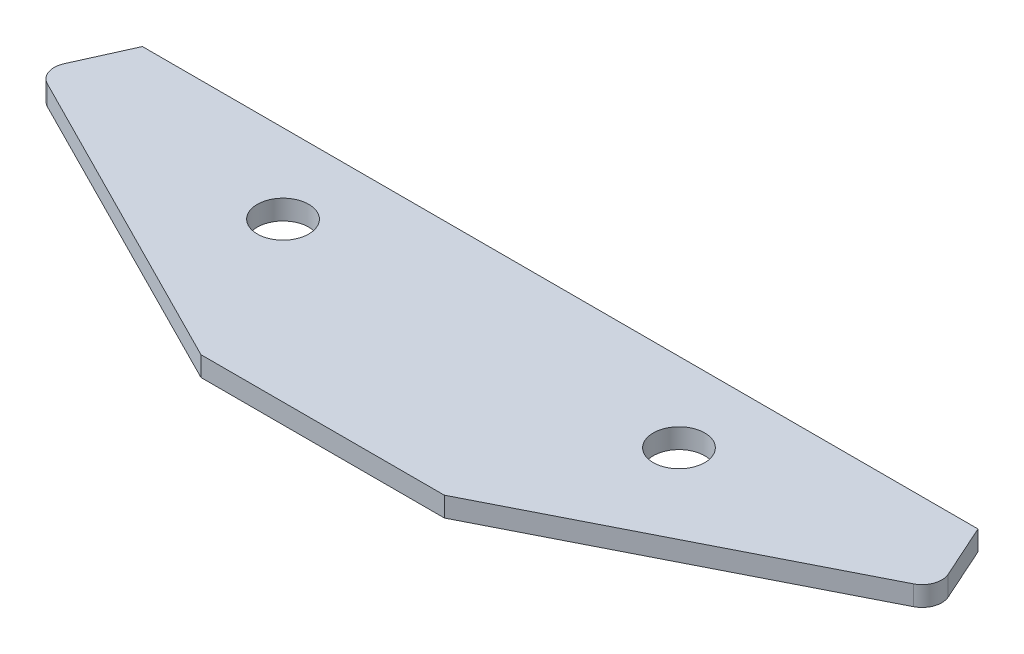
ISO-10303-21;
HEADER;
FILE_DESCRIPTION(('STEP AP214'),'2;1');
FILE_NAME('part.step','',(''),(''),'','','');
FILE_SCHEMA(('AUTOMOTIVE_DESIGN { 1 0 10303 214 1 1 1 1 }'));
ENDSEC;
DATA;
#1=APPLICATION_CONTEXT('core data for automotive mechanical design processes');
#2=APPLICATION_PROTOCOL_DEFINITION('international standard','automotive_design',2000,#1);
#3=PRODUCT_CONTEXT('',#1,'mechanical');
#4=PRODUCT('Part','Part','',(#3));
#5=PRODUCT_RELATED_PRODUCT_CATEGORY('part','',(#4));
#6=PRODUCT_DEFINITION_FORMATION('','',#4);
#7=PRODUCT_DEFINITION_CONTEXT('part definition',#1,'design');
#8=PRODUCT_DEFINITION('design','',#6,#7);
#9=PRODUCT_DEFINITION_SHAPE('','',#8);
#10=(LENGTH_UNIT() NAMED_UNIT(*) SI_UNIT(.MILLI.,.METRE.));
#11=(NAMED_UNIT(*) PLANE_ANGLE_UNIT() SI_UNIT($,.RADIAN.));
#12=(NAMED_UNIT(*) SI_UNIT($,.STERADIAN.) SOLID_ANGLE_UNIT());
#13=UNCERTAINTY_MEASURE_WITH_UNIT(LENGTH_MEASURE(1.E-05),#10,'distance_accuracy_value','');
#14=(GEOMETRIC_REPRESENTATION_CONTEXT(3) GLOBAL_UNCERTAINTY_ASSIGNED_CONTEXT((#13)) GLOBAL_UNIT_ASSIGNED_CONTEXT((#10,
#11,#12)) REPRESENTATION_CONTEXT('',''));
#15=CARTESIAN_POINT('',(0.,0.,0.));
#16=DIRECTION('',(0.,0.,1.));
#17=DIRECTION('',(1.,0.,0.));
#18=AXIS2_PLACEMENT_3D('',#15,#16,#17);
#19=CARTESIAN_POINT('',(-174.030687800207,10.,-52.5933410586918));
#20=DIRECTION('',(0.,0.,1.));
#21=DIRECTION('',(1.,0.,0.));
#22=AXIS2_PLACEMENT_3D('',#19,#20,#21);
#23=PLANE('',#22);
#24=DIRECTION('',(-1.,0.,0.));
#25=VECTOR('',#24,1.);
#26=CARTESIAN_POINT('',(-174.030687800207,0.,-52.5933410586918));
#27=LINE('',#26,#25);
#28=CARTESIAN_POINT('',(248.032931617598,0.,-52.5933410586918));
#29=VERTEX_POINT('',#28);
#30=CARTESIAN_POINT('',(-174.030687800207,0.,-52.5933410586918));
#31=VERTEX_POINT('',#30);
#32=EDGE_CURVE('E130',#29,#31,#27,.T.);
#33=ORIENTED_EDGE('',*,*,#32,.T.);
#34=DIRECTION('',(0.,-1.,0.));
#35=VECTOR('',#34,1.);
#36=CARTESIAN_POINT('',(-174.030687800207,10.,-52.5933410586918));
#37=LINE('',#36,#35);
#38=CARTESIAN_POINT('',(-174.030687800207,10.,-52.5933410586918));
#39=VERTEX_POINT('',#38);
#40=EDGE_CURVE('E40',#39,#31,#37,.T.);
#41=ORIENTED_EDGE('',*,*,#40,.F.);
#42=DIRECTION('',(-1.,0.,0.));
#43=VECTOR('',#42,1.);
#44=CARTESIAN_POINT('',(-174.030687800207,10.,-52.5933410586918));
#45=LINE('',#44,#43);
#46=CARTESIAN_POINT('',(248.032931617598,10.,-52.5933410586918));
#47=VERTEX_POINT('',#46);
#48=EDGE_CURVE('E145',#47,#39,#45,.T.);
#49=ORIENTED_EDGE('',*,*,#48,.F.);
#50=DIRECTION('',(0.,-1.,0.));
#51=VECTOR('',#50,1.);
#52=CARTESIAN_POINT('',(248.032931617598,10.,-52.5933410586918));
#53=LINE('',#52,#51);
#54=EDGE_CURVE('E126',#47,#29,#53,.T.);
#55=ORIENTED_EDGE('',*,*,#54,.T.);
#56=EDGE_LOOP('',(#33,#41,#49,#55));
#57=FACE_BOUND('',#56,.T.);
#58=ADVANCED_FACE('F33',(#57),#23,.F.);
#59=CARTESIAN_POINT('',(-174.030687800207,10.,-52.5933410586918));
#60=DIRECTION('',(0.91215918004391,0.,0.409836101706063));
#61=DIRECTION('',(0.409836101706063,0.,-0.91215918004391));
#62=AXIS2_PLACEMENT_3D('',#59,#60,#61);
#63=PLANE('',#62);
#64=DIRECTION('',(-0.409836101706063,0.,0.91215918004391));
#65=VECTOR('',#64,1.);
#66=CARTESIAN_POINT('',(-174.030687800207,0.,-52.5933410586918));
#67=LINE('',#66,#65);
#68=CARTESIAN_POINT('',(-186.30332408999,0.,-25.2785247004834));
#69=VERTEX_POINT('',#68);
#70=EDGE_CURVE('E133',#31,#69,#67,.T.);
#71=ORIENTED_EDGE('',*,*,#70,.T.);
#72=DIRECTION('',(0.,-1.,0.));
#73=VECTOR('',#72,1.);
#74=CARTESIAN_POINT('',(-186.30332408999,10.,-25.2785247004834));
#75=LINE('',#74,#73);
#76=CARTESIAN_POINT('',(-186.30332408999,10.,-25.2785247004834));
#77=VERTEX_POINT('',#76);
#78=EDGE_CURVE('E150',#77,#69,#75,.T.);
#79=ORIENTED_EDGE('',*,*,#78,.F.);
#80=DIRECTION('',(-0.409836101706063,0.,0.91215918004391));
#81=VECTOR('',#80,1.);
#82=CARTESIAN_POINT('',(-174.030687800207,10.,-52.5933410586918));
#83=LINE('',#82,#81);
#84=EDGE_CURVE('E91',#39,#77,#83,.T.);
#85=ORIENTED_EDGE('',*,*,#84,.F.);
#86=ORIENTED_EDGE('',*,*,#40,.T.);
#87=EDGE_LOOP('',(#71,#79,#85,#86));
#88=FACE_BOUND('',#87,.T.);
#89=ADVANCED_FACE('F153',(#88),#63,.F.);
#90=CARTESIAN_POINT('',(-177.181732289551,10.,-21.1801636834228));
#91=DIRECTION('',(0.,-1.,0.));
#92=DIRECTION('',(0.,0.,-1.));
#93=AXIS2_PLACEMENT_3D('',#90,#91,#92);
#94=CYLINDRICAL_SURFACE('',#93,10.);
#95=CARTESIAN_POINT('',(-177.181732289551,0.,-21.1801636834228));
#96=DIRECTION('',(0.,1.,0.));
#97=DIRECTION('',(0.,0.,1.));
#98=AXIS2_PLACEMENT_3D('',#95,#96,#97);
#99=CIRCLE('',#98,10.);
#100=CARTESIAN_POINT('',(-181.70123706956,0.,-12.2597333942791));
#101=VERTEX_POINT('',#100);
#102=EDGE_CURVE('E136',#69,#101,#99,.T.);
#103=ORIENTED_EDGE('',*,*,#102,.T.);
#104=DIRECTION('',(0.,-1.,0.));
#105=VECTOR('',#104,1.);
#106=CARTESIAN_POINT('',(-181.70123706956,10.,-12.2597333942791));
#107=LINE('',#106,#105);
#108=CARTESIAN_POINT('',(-181.70123706956,10.,-12.2597333942791));
#109=VERTEX_POINT('',#108);
#110=EDGE_CURVE('E121',#109,#101,#107,.T.);
#111=ORIENTED_EDGE('',*,*,#110,.F.);
#112=CARTESIAN_POINT('',(-177.181732289551,10.,-21.1801636834228));
#113=DIRECTION('',(0.,1.,0.));
#114=DIRECTION('',(0.,0.,1.));
#115=AXIS2_PLACEMENT_3D('',#112,#113,#114);
#116=CIRCLE('',#115,10.);
#117=EDGE_CURVE('E170',#77,#109,#116,.T.);
#118=ORIENTED_EDGE('',*,*,#117,.F.);
#119=ORIENTED_EDGE('',*,*,#78,.T.);
#120=EDGE_LOOP('',(#103,#111,#118,#119));
#121=FACE_BOUND('',#120,.T.);
#122=ADVANCED_FACE('F164',(#121),#94,.T.);
#123=CARTESIAN_POINT('',(32.4816171286858,10.,96.255259937727));
#124=DIRECTION('',(0.451950478000949,0.,-0.892043028914365));
#125=DIRECTION('',(-0.892043028914365,0.,-0.451950478000949));
#126=AXIS2_PLACEMENT_3D('',#123,#124,#125);
#127=PLANE('',#126);
#128=DIRECTION('',(0.892043028914365,0.,0.451950478000949));
#129=VECTOR('',#128,1.);
#130=CARTESIAN_POINT('',(32.4816171286858,0.,96.255259937727));
#131=LINE('',#130,#129);
#132=CARTESIAN_POINT('',(-24.4586775837213,0.,67.4066589413083));
#133=VERTEX_POINT('',#132);
#134=EDGE_CURVE('E138',#101,#133,#131,.T.);
#135=ORIENTED_EDGE('',*,*,#134,.T.);
#136=DIRECTION('',(0.,1.,0.));
#137=VECTOR('',#136,1.);
#138=CARTESIAN_POINT('',(-24.4586775837214,10.,67.4066589413083));
#139=LINE('',#138,#137);
#140=CARTESIAN_POINT('',(-24.4586775837213,10.,67.4066589413083));
#141=VERTEX_POINT('',#140);
#142=EDGE_CURVE('E46',#133,#141,#139,.T.);
#143=ORIENTED_EDGE('',*,*,#142,.T.);
#144=DIRECTION('',(0.892043028914365,0.,0.451950478000949));
#145=VECTOR('',#144,1.);
#146=CARTESIAN_POINT('',(32.4816171286858,10.,96.255259937727));
#147=LINE('',#146,#145);
#148=EDGE_CURVE('E112',#109,#141,#147,.T.);
#149=ORIENTED_EDGE('',*,*,#148,.F.);
#150=ORIENTED_EDGE('',*,*,#110,.T.);
#151=EDGE_LOOP('',(#135,#143,#149,#150));
#152=FACE_BOUND('',#151,.T.);
#153=ADVANCED_FACE('F168',(#152),#127,.F.);
#154=CARTESIAN_POINT('',(41.5206266887048,10.,96.255259937727));
#155=DIRECTION('',(-0.451950478000949,0.,-0.892043028914365));
#156=DIRECTION('',(-0.892043028914365,0.,0.451950478000949));
#157=AXIS2_PLACEMENT_3D('',#154,#155,#156);
#158=PLANE('',#157);
#159=DIRECTION('',(0.892043028914365,0.,-0.451950478000949));
#160=VECTOR('',#159,1.);
#161=CARTESIAN_POINT('',(41.5206266887048,10.,96.255259937727));
#162=LINE('',#161,#160);
#163=CARTESIAN_POINT('',(98.4609214011119,10.,67.4066589413083));
#164=VERTEX_POINT('',#163);
#165=CARTESIAN_POINT('',(255.703480886951,10.,-12.2597333942791));
#166=VERTEX_POINT('',#165);
#167=EDGE_CURVE('E101',#164,#166,#162,.T.);
#168=ORIENTED_EDGE('',*,*,#167,.F.);
#169=DIRECTION('',(0.,-1.,0.));
#170=VECTOR('',#169,1.);
#171=CARTESIAN_POINT('',(98.460921401112,10.,67.4066589413083));
#172=LINE('',#171,#170);
#173=CARTESIAN_POINT('',(98.4609214011119,0.,67.4066589413083));
#174=VERTEX_POINT('',#173);
#175=EDGE_CURVE('E187',#164,#174,#172,.T.);
#176=ORIENTED_EDGE('',*,*,#175,.T.);
#177=DIRECTION('',(0.892043028914365,0.,-0.451950478000949));
#178=VECTOR('',#177,1.);
#179=CARTESIAN_POINT('',(41.5206266887048,0.,96.255259937727));
#180=LINE('',#179,#178);
#181=CARTESIAN_POINT('',(255.703480886951,0.,-12.2597333942791));
#182=VERTEX_POINT('',#181);
#183=EDGE_CURVE('E118',#174,#182,#180,.T.);
#184=ORIENTED_EDGE('',*,*,#183,.T.);
#185=DIRECTION('',(0.,-1.,0.));
#186=VECTOR('',#185,1.);
#187=CARTESIAN_POINT('',(255.703480886951,10.,-12.2597333942791));
#188=LINE('',#187,#186);
#189=EDGE_CURVE('E115',#166,#182,#188,.T.);
#190=ORIENTED_EDGE('',*,*,#189,.F.);
#191=EDGE_LOOP('',(#168,#176,#184,#190));
#192=FACE_BOUND('',#191,.T.);
#193=ADVANCED_FACE('F116',(#192),#158,.F.);
#194=CARTESIAN_POINT('',(251.183976106941,10.,-21.1801636834228));
#195=DIRECTION('',(0.,-1.,0.));
#196=DIRECTION('',(0.,0.,-1.));
#197=AXIS2_PLACEMENT_3D('',#194,#195,#196);
#198=CYLINDRICAL_SURFACE('',#197,10.);
#199=CARTESIAN_POINT('',(251.183976106941,0.,-21.1801636834228));
#200=DIRECTION('',(0.,1.,0.));
#201=DIRECTION('',(0.,0.,-1.));
#202=AXIS2_PLACEMENT_3D('',#199,#200,#201);
#203=CIRCLE('',#202,10.);
#204=CARTESIAN_POINT('',(260.305567907381,0.,-25.2785247004834));
#205=VERTEX_POINT('',#204);
#206=EDGE_CURVE('E142',#182,#205,#203,.T.);
#207=ORIENTED_EDGE('',*,*,#206,.T.);
#208=DIRECTION('',(0.,-1.,0.));
#209=VECTOR('',#208,1.);
#210=CARTESIAN_POINT('',(260.305567907381,10.,-25.2785247004834));
#211=LINE('',#210,#209);
#212=CARTESIAN_POINT('',(260.305567907381,10.,-25.2785247004834));
#213=VERTEX_POINT('',#212);
#214=EDGE_CURVE('E122',#213,#205,#211,.T.);
#215=ORIENTED_EDGE('',*,*,#214,.F.);
#216=CARTESIAN_POINT('',(251.183976106941,10.,-21.1801636834228));
#217=DIRECTION('',(0.,1.,0.));
#218=DIRECTION('',(0.,0.,-1.));
#219=AXIS2_PLACEMENT_3D('',#216,#217,#218);
#220=CIRCLE('',#219,10.);
#221=EDGE_CURVE('E106',#166,#213,#220,.T.);
#222=ORIENTED_EDGE('',*,*,#221,.F.);
#223=ORIENTED_EDGE('',*,*,#189,.T.);
#224=EDGE_LOOP('',(#207,#215,#222,#223));
#225=FACE_BOUND('',#224,.T.);
#226=ADVANCED_FACE('F124',(#225),#198,.T.);
#227=CARTESIAN_POINT('',(248.032931617598,10.,-52.5933410586918));
#228=DIRECTION('',(-0.912159180043909,0.,0.409836101706064));
#229=DIRECTION('',(0.409836101706064,0.,0.912159180043909));
#230=AXIS2_PLACEMENT_3D('',#227,#228,#229);
#231=PLANE('',#230);
#232=DIRECTION('',(-0.409836101706064,0.,-0.912159180043909));
#233=VECTOR('',#232,1.);
#234=CARTESIAN_POINT('',(248.032931617598,0.,-52.5933410586918));
#235=LINE('',#234,#233);
#236=EDGE_CURVE('E82',#205,#29,#235,.T.);
#237=ORIENTED_EDGE('',*,*,#236,.T.);
#238=ORIENTED_EDGE('',*,*,#54,.F.);
#239=DIRECTION('',(-0.409836101706064,0.,-0.912159180043909));
#240=VECTOR('',#239,1.);
#241=CARTESIAN_POINT('',(248.032931617598,10.,-52.5933410586918));
#242=LINE('',#241,#240);
#243=EDGE_CURVE('E55',#213,#47,#242,.T.);
#244=ORIENTED_EDGE('',*,*,#243,.F.);
#245=ORIENTED_EDGE('',*,*,#214,.T.);
#246=EDGE_LOOP('',(#237,#238,#244,#245));
#247=FACE_BOUND('',#246,.T.);
#248=ADVANCED_FACE('F192',(#247),#231,.F.);
#249=CARTESIAN_POINT('',(251.183976106941,10.,-21.1801636834228));
#250=DIRECTION('',(0.,-1.,0.));
#251=DIRECTION('',(0.,0.,-1.));
#252=AXIS2_PLACEMENT_3D('',#249,#250,#251);
#253=PLANE('',#252);
#254=CARTESIAN_POINT('',(137.001121908695,10.,-12.5933410586918));
#255=DIRECTION('',(0.,1.,0.));
#256=DIRECTION('',(0.,0.,1.));
#257=AXIS2_PLACEMENT_3D('',#254,#255,#256);
#258=CIRCLE('',#257,13.);
#259=CARTESIAN_POINT('',(137.001121908695,10.,0.406658941308249));
#260=VERTEX_POINT('',#259);
#261=EDGE_CURVE('E181',#260,#260,#258,.T.);
#262=ORIENTED_EDGE('',*,*,#261,.F.);
#263=EDGE_LOOP('',(#262));
#264=FACE_BOUND('',#263,.T.);
#265=CARTESIAN_POINT('',(-62.9988780913047,10.,-12.5933410586917));
#266=DIRECTION('',(0.,1.,0.));
#267=DIRECTION('',(0.,0.,1.));
#268=AXIS2_PLACEMENT_3D('',#265,#266,#267);
#269=CIRCLE('',#268,13.);
#270=CARTESIAN_POINT('',(-62.9988780913047,10.,0.406658941308259));
#271=VERTEX_POINT('',#270);
#272=EDGE_CURVE('E175',#271,#271,#269,.T.);
#273=ORIENTED_EDGE('',*,*,#272,.F.);
#274=EDGE_LOOP('',(#273));
#275=FACE_BOUND('',#274,.T.);
#276=ORIENTED_EDGE('',*,*,#148,.T.);
#277=DIRECTION('',(-1.,0.,0.));
#278=VECTOR('',#277,1.);
#279=CARTESIAN_POINT('',(37.0011219086953,10.,67.4066589413083));
#280=LINE('',#279,#278);
#281=EDGE_CURVE('E109',#164,#141,#280,.T.);
#282=ORIENTED_EDGE('',*,*,#281,.F.);
#283=ORIENTED_EDGE('',*,*,#167,.T.);
#284=ORIENTED_EDGE('',*,*,#221,.T.);
#285=ORIENTED_EDGE('',*,*,#243,.T.);
#286=ORIENTED_EDGE('',*,*,#48,.T.);
#287=ORIENTED_EDGE('',*,*,#84,.T.);
#288=ORIENTED_EDGE('',*,*,#117,.T.);
#289=EDGE_LOOP('',(#276,#282,#283,#284,#285,#286,#287,#288));
#290=FACE_BOUND('',#289,.T.);
#291=ADVANCED_FACE('F104',(#264,#275,#290),#253,.F.);
#292=CARTESIAN_POINT('',(251.183976106941,0.,-21.1801636834228));
#293=DIRECTION('',(0.,-1.,0.));
#294=DIRECTION('',(0.,0.,-1.));
#295=AXIS2_PLACEMENT_3D('',#292,#293,#294);
#296=PLANE('',#295);
#297=DIRECTION('',(1.,0.,0.));
#298=VECTOR('',#297,1.);
#299=CARTESIAN_POINT('',(251.183976106941,0.,67.4066589413083));
#300=LINE('',#299,#298);
#301=EDGE_CURVE('E11',#133,#174,#300,.T.);
#302=ORIENTED_EDGE('',*,*,#301,.F.);
#303=ORIENTED_EDGE('',*,*,#134,.F.);
#304=ORIENTED_EDGE('',*,*,#102,.F.);
#305=ORIENTED_EDGE('',*,*,#70,.F.);
#306=ORIENTED_EDGE('',*,*,#32,.F.);
#307=ORIENTED_EDGE('',*,*,#236,.F.);
#308=ORIENTED_EDGE('',*,*,#206,.F.);
#309=ORIENTED_EDGE('',*,*,#183,.F.);
#310=EDGE_LOOP('',(#302,#303,#304,#305,#306,#307,#308,#309));
#311=FACE_BOUND('',#310,.T.);
#312=CARTESIAN_POINT('',(137.001121908695,0.,-12.5933410586918));
#313=DIRECTION('',(0.,1.,0.));
#314=DIRECTION('',(0.,0.,1.));
#315=AXIS2_PLACEMENT_3D('',#312,#313,#314);
#316=CIRCLE('',#315,13.);
#317=CARTESIAN_POINT('',(137.001121908695,0.,0.406658941308249));
#318=VERTEX_POINT('',#317);
#319=EDGE_CURVE('E134',#318,#318,#316,.T.);
#320=ORIENTED_EDGE('',*,*,#319,.T.);
#321=EDGE_LOOP('',(#320));
#322=FACE_BOUND('',#321,.T.);
#323=CARTESIAN_POINT('',(-62.9988780913047,0.,-12.5933410586917));
#324=DIRECTION('',(0.,1.,0.));
#325=DIRECTION('',(0.,0.,1.));
#326=AXIS2_PLACEMENT_3D('',#323,#324,#325);
#327=CIRCLE('',#326,13.);
#328=CARTESIAN_POINT('',(-62.9988780913047,0.,0.406658941308259));
#329=VERTEX_POINT('',#328);
#330=EDGE_CURVE('E178',#329,#329,#327,.T.);
#331=ORIENTED_EDGE('',*,*,#330,.T.);
#332=EDGE_LOOP('',(#331));
#333=FACE_BOUND('',#332,.T.);
#334=ADVANCED_FACE('F158',(#311,#322,#333),#296,.T.);
#335=CARTESIAN_POINT('',(-62.9988780913047,0.,-12.5933410586917));
#336=DIRECTION('',(0.,1.,0.));
#337=DIRECTION('',(0.,0.,1.));
#338=AXIS2_PLACEMENT_3D('',#335,#336,#337);
#339=CYLINDRICAL_SURFACE('',#338,13.);
#340=ORIENTED_EDGE('',*,*,#330,.F.);
#341=EDGE_LOOP('',(#340));
#342=FACE_BOUND('',#341,.T.);
#343=ORIENTED_EDGE('',*,*,#272,.T.);
#344=EDGE_LOOP('',(#343));
#345=FACE_BOUND('',#344,.T.);
#346=ADVANCED_FACE('F237',(#342,#345),#339,.F.);
#347=CARTESIAN_POINT('',(137.001121908695,0.,-12.5933410586918));
#348=DIRECTION('',(0.,1.,0.));
#349=DIRECTION('',(0.,0.,1.));
#350=AXIS2_PLACEMENT_3D('',#347,#348,#349);
#351=CYLINDRICAL_SURFACE('',#350,13.);
#352=ORIENTED_EDGE('',*,*,#319,.F.);
#353=EDGE_LOOP('',(#352));
#354=FACE_BOUND('',#353,.T.);
#355=ORIENTED_EDGE('',*,*,#261,.T.);
#356=EDGE_LOOP('',(#355));
#357=FACE_BOUND('',#356,.T.);
#358=ADVANCED_FACE('F242',(#354,#357),#351,.F.);
#359=CARTESIAN_POINT('',(37.0011219086953,0.,67.4066589413083));
#360=DIRECTION('',(0.,0.,-1.));
#361=DIRECTION('',(-1.,0.,0.));
#362=AXIS2_PLACEMENT_3D('',#359,#360,#361);
#363=PLANE('',#362);
#364=ORIENTED_EDGE('',*,*,#301,.T.);
#365=ORIENTED_EDGE('',*,*,#175,.F.);
#366=ORIENTED_EDGE('',*,*,#281,.T.);
#367=ORIENTED_EDGE('',*,*,#142,.F.);
#368=EDGE_LOOP('',(#364,#365,#366,#367));
#369=FACE_BOUND('',#368,.T.);
#370=ADVANCED_FACE('F190',(#369),#363,.F.);
#371=CLOSED_SHELL('',(#58,#89,#122,#153,#193,#226,#248,#291,#334,#346,#358,#370));
#372=MANIFOLD_SOLID_BREP('B2',#371);
#373=ADVANCED_BREP_SHAPE_REPRESENTATION('',(#18,#372),#14);
#374=SHAPE_DEFINITION_REPRESENTATION(#9,#373);
ENDSEC;
END-ISO-10303-21;
